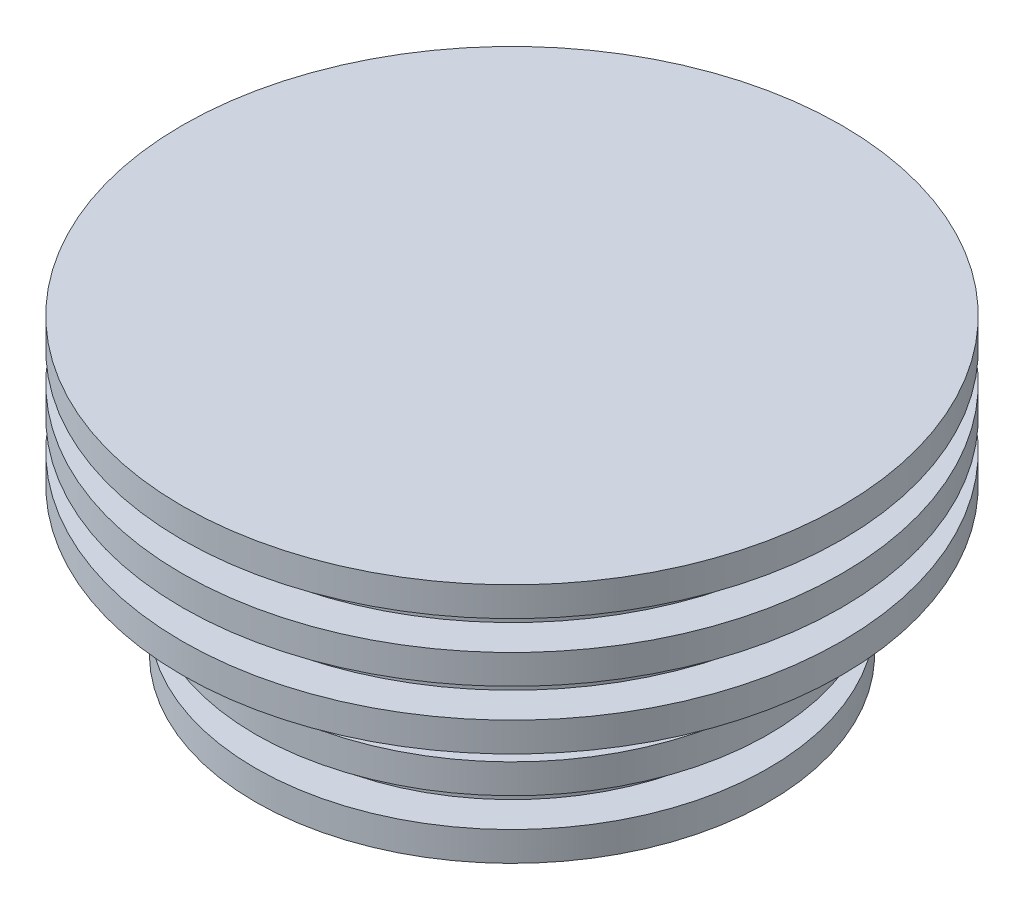
ISO-10303-21;
HEADER;
FILE_DESCRIPTION(('STEP AP214'),'2;1');
FILE_NAME('part.step','',(''),(''),'','','');
FILE_SCHEMA(('AUTOMOTIVE_DESIGN { 1 0 10303 214 1 1 1 1 }'));
ENDSEC;
DATA;
#1=APPLICATION_CONTEXT('core data for automotive mechanical design processes');
#2=APPLICATION_PROTOCOL_DEFINITION('international standard','automotive_design',2000,#1);
#3=PRODUCT_CONTEXT('',#1,'mechanical');
#4=PRODUCT('Part','Part','',(#3));
#5=PRODUCT_RELATED_PRODUCT_CATEGORY('part','',(#4));
#6=PRODUCT_DEFINITION_FORMATION('','',#4);
#7=PRODUCT_DEFINITION_CONTEXT('part definition',#1,'design');
#8=PRODUCT_DEFINITION('design','',#6,#7);
#9=PRODUCT_DEFINITION_SHAPE('','',#8);
#10=(LENGTH_UNIT() NAMED_UNIT(*) SI_UNIT(.MILLI.,.METRE.));
#11=(NAMED_UNIT(*) PLANE_ANGLE_UNIT() SI_UNIT($,.RADIAN.));
#12=(NAMED_UNIT(*) SI_UNIT($,.STERADIAN.) SOLID_ANGLE_UNIT());
#13=UNCERTAINTY_MEASURE_WITH_UNIT(LENGTH_MEASURE(1.E-05),#10,'distance_accuracy_value','');
#14=(GEOMETRIC_REPRESENTATION_CONTEXT(3) GLOBAL_UNCERTAINTY_ASSIGNED_CONTEXT((#13)) GLOBAL_UNIT_ASSIGNED_CONTEXT((#10,
#11,#12)) REPRESENTATION_CONTEXT('',''));
#15=CARTESIAN_POINT('',(0.,0.,0.));
#16=DIRECTION('',(0.,0.,1.));
#17=DIRECTION('',(1.,0.,0.));
#18=AXIS2_PLACEMENT_3D('',#15,#16,#17);
#19=CARTESIAN_POINT('',(0.,12.7,0.));
#20=DIRECTION('',(0.,-1.,0.));
#21=DIRECTION('',(0.,0.,-1.));
#22=AXIS2_PLACEMENT_3D('',#19,#20,#21);
#23=CYLINDRICAL_SURFACE('',#22,19.05);
#24=CARTESIAN_POINT('',(0.,2.54,0.));
#25=DIRECTION('',(0.,1.,0.));
#26=DIRECTION('',(0.,0.,1.));
#27=AXIS2_PLACEMENT_3D('',#24,#25,#26);
#28=CIRCLE('',#27,19.05);
#29=CARTESIAN_POINT('',(0.,2.54,19.05));
#30=VERTEX_POINT('',#29);
#31=EDGE_CURVE('E98',#30,#30,#28,.T.);
#32=ORIENTED_EDGE('',*,*,#31,.T.);
#33=EDGE_LOOP('',(#32));
#34=FACE_BOUND('',#33,.T.);
#35=CARTESIAN_POINT('',(0.,5.08,0.));
#36=DIRECTION('',(0.,1.,0.));
#37=DIRECTION('',(0.,0.,1.));
#38=AXIS2_PLACEMENT_3D('',#35,#36,#37);
#39=CIRCLE('',#38,19.05);
#40=CARTESIAN_POINT('',(0.,5.08,19.05));
#41=VERTEX_POINT('',#40);
#42=EDGE_CURVE('E86',#41,#41,#39,.T.);
#43=ORIENTED_EDGE('',*,*,#42,.F.);
#44=EDGE_LOOP('',(#43));
#45=FACE_BOUND('',#44,.T.);
#46=ADVANCED_FACE('F43',(#34,#45),#23,.T.);
#47=CARTESIAN_POINT('',(0.,2.54,0.));
#48=DIRECTION('',(0.,1.,0.));
#49=DIRECTION('',(0.,0.,1.));
#50=AXIS2_PLACEMENT_3D('',#47,#48,#49);
#51=PLANE('',#50);
#52=CARTESIAN_POINT('',(0.,2.54,0.));
#53=DIRECTION('',(0.,1.,0.));
#54=DIRECTION('',(0.,0.,1.));
#55=AXIS2_PLACEMENT_3D('',#52,#53,#54);
#56=CIRCLE('',#55,22.225);
#57=CARTESIAN_POINT('',(0.,2.54,22.225));
#58=VERTEX_POINT('',#57);
#59=EDGE_CURVE('E61',#58,#58,#56,.T.);
#60=ORIENTED_EDGE('',*,*,#59,.T.);
#61=EDGE_LOOP('',(#60));
#62=FACE_BOUND('',#61,.T.);
#63=ORIENTED_EDGE('',*,*,#31,.F.);
#64=EDGE_LOOP('',(#63));
#65=FACE_BOUND('',#64,.T.);
#66=ADVANCED_FACE('F122',(#62,#65),#51,.T.);
#67=CARTESIAN_POINT('',(0.,0.,0.));
#68=DIRECTION('',(0.,1.,0.));
#69=DIRECTION('',(0.,0.,1.));
#70=AXIS2_PLACEMENT_3D('',#67,#68,#69);
#71=PLANE('',#70);
#72=CARTESIAN_POINT('',(0.,0.,0.));
#73=DIRECTION('',(0.,1.,0.));
#74=DIRECTION('',(0.,0.,1.));
#75=AXIS2_PLACEMENT_3D('',#72,#73,#74);
#76=CIRCLE('',#75,22.225);
#77=CARTESIAN_POINT('',(0.,0.,22.225));
#78=VERTEX_POINT('',#77);
#79=EDGE_CURVE('E113',#78,#78,#76,.T.);
#80=ORIENTED_EDGE('',*,*,#79,.F.);
#81=EDGE_LOOP('',(#80));
#82=FACE_BOUND('',#81,.T.);
#83=ADVANCED_FACE('F125',(#82),#71,.F.);
#84=CARTESIAN_POINT('',(0.,2.54,0.));
#85=DIRECTION('',(0.,-1.,0.));
#86=DIRECTION('',(0.,0.,-1.));
#87=AXIS2_PLACEMENT_3D('',#84,#85,#86);
#88=CYLINDRICAL_SURFACE('',#87,22.225);
#89=ORIENTED_EDGE('',*,*,#59,.F.);
#90=EDGE_LOOP('',(#89));
#91=FACE_BOUND('',#90,.T.);
#92=ORIENTED_EDGE('',*,*,#79,.T.);
#93=EDGE_LOOP('',(#92));
#94=FACE_BOUND('',#93,.T.);
#95=ADVANCED_FACE('F44',(#91,#94),#88,.T.);
#96=CARTESIAN_POINT('',(0.,7.62,0.));
#97=DIRECTION('',(0.,1.,0.));
#98=DIRECTION('',(0.,0.,1.));
#99=AXIS2_PLACEMENT_3D('',#96,#97,#98);
#100=PLANE('',#99);
#101=CARTESIAN_POINT('',(0.,7.62,0.));
#102=DIRECTION('',(0.,1.,0.));
#103=DIRECTION('',(0.,0.,1.));
#104=AXIS2_PLACEMENT_3D('',#101,#102,#103);
#105=CIRCLE('',#104,22.225);
#106=CARTESIAN_POINT('',(0.,7.62,22.225));
#107=VERTEX_POINT('',#106);
#108=EDGE_CURVE('E94',#107,#107,#105,.T.);
#109=ORIENTED_EDGE('',*,*,#108,.T.);
#110=EDGE_LOOP('',(#109));
#111=FACE_BOUND('',#110,.T.);
#112=CARTESIAN_POINT('',(0.,7.62,0.));
#113=DIRECTION('',(0.,1.,0.));
#114=DIRECTION('',(0.,0.,1.));
#115=AXIS2_PLACEMENT_3D('',#112,#113,#114);
#116=CIRCLE('',#115,19.05);
#117=CARTESIAN_POINT('',(0.,7.62,19.05));
#118=VERTEX_POINT('',#117);
#119=EDGE_CURVE('E57',#118,#118,#116,.F.);
#120=ORIENTED_EDGE('',*,*,#119,.T.);
#121=EDGE_LOOP('',(#120));
#122=FACE_BOUND('',#121,.T.);
#123=ADVANCED_FACE('F128',(#111,#122),#100,.T.);
#124=CARTESIAN_POINT('',(0.,5.08,0.));
#125=DIRECTION('',(0.,1.,0.));
#126=DIRECTION('',(0.,0.,1.));
#127=AXIS2_PLACEMENT_3D('',#124,#125,#126);
#128=PLANE('',#127);
#129=CARTESIAN_POINT('',(0.,5.08,0.));
#130=DIRECTION('',(0.,1.,0.));
#131=DIRECTION('',(0.,0.,1.));
#132=AXIS2_PLACEMENT_3D('',#129,#130,#131);
#133=CIRCLE('',#132,22.225);
#134=CARTESIAN_POINT('',(0.,5.08,22.225));
#135=VERTEX_POINT('',#134);
#136=EDGE_CURVE('E95',#135,#135,#133,.T.);
#137=ORIENTED_EDGE('',*,*,#136,.F.);
#138=EDGE_LOOP('',(#137));
#139=FACE_BOUND('',#138,.T.);
#140=ORIENTED_EDGE('',*,*,#42,.T.);
#141=EDGE_LOOP('',(#140));
#142=FACE_BOUND('',#141,.T.);
#143=ADVANCED_FACE('F152',(#139,#142),#128,.F.);
#144=CARTESIAN_POINT('',(0.,7.62,0.));
#145=DIRECTION('',(0.,-1.,0.));
#146=DIRECTION('',(0.,0.,-1.));
#147=AXIS2_PLACEMENT_3D('',#144,#145,#146);
#148=CYLINDRICAL_SURFACE('',#147,22.225);
#149=ORIENTED_EDGE('',*,*,#108,.F.);
#150=EDGE_LOOP('',(#149));
#151=FACE_BOUND('',#150,.T.);
#152=ORIENTED_EDGE('',*,*,#136,.T.);
#153=EDGE_LOOP('',(#152));
#154=FACE_BOUND('',#153,.T.);
#155=ADVANCED_FACE('F144',(#151,#154),#148,.T.);
#156=ORIENTED_EDGE('',*,*,#119,.F.);
#157=EDGE_LOOP('',(#156));
#158=FACE_BOUND('',#157,.T.);
#159=CARTESIAN_POINT('',(0.,10.16,0.));
#160=DIRECTION('',(0.,1.,0.));
#161=DIRECTION('',(0.,0.,1.));
#162=AXIS2_PLACEMENT_3D('',#159,#160,#161);
#163=CIRCLE('',#162,19.05);
#164=CARTESIAN_POINT('',(0.,10.16,19.05));
#165=VERTEX_POINT('',#164);
#166=EDGE_CURVE('E83',#165,#165,#163,.T.);
#167=ORIENTED_EDGE('',*,*,#166,.F.);
#168=EDGE_LOOP('',(#167));
#169=FACE_BOUND('',#168,.T.);
#170=ADVANCED_FACE('F136',(#158,#169),#23,.T.);
#171=CARTESIAN_POINT('',(0.,10.16,0.));
#172=DIRECTION('',(0.,1.,0.));
#173=DIRECTION('',(0.,0.,1.));
#174=AXIS2_PLACEMENT_3D('',#171,#172,#173);
#175=PLANE('',#174);
#176=CARTESIAN_POINT('',(0.,10.16,0.));
#177=DIRECTION('',(0.,1.,0.));
#178=DIRECTION('',(0.,0.,1.));
#179=AXIS2_PLACEMENT_3D('',#176,#177,#178);
#180=CIRCLE('',#179,22.225);
#181=CARTESIAN_POINT('',(0.,10.16,22.225));
#182=VERTEX_POINT('',#181);
#183=EDGE_CURVE('E104',#182,#182,#180,.T.);
#184=ORIENTED_EDGE('',*,*,#183,.F.);
#185=EDGE_LOOP('',(#184));
#186=FACE_BOUND('',#185,.T.);
#187=ORIENTED_EDGE('',*,*,#166,.T.);
#188=EDGE_LOOP('',(#187));
#189=FACE_BOUND('',#188,.T.);
#190=ADVANCED_FACE('F145',(#186,#189),#175,.F.);
#191=CARTESIAN_POINT('',(0.,12.7,0.));
#192=DIRECTION('',(0.,-1.,0.));
#193=DIRECTION('',(0.,0.,-1.));
#194=AXIS2_PLACEMENT_3D('',#191,#192,#193);
#195=CYLINDRICAL_SURFACE('',#194,22.225);
#196=CARTESIAN_POINT('',(0.,12.7,0.));
#197=DIRECTION('',(0.,1.,0.));
#198=DIRECTION('',(0.,0.,1.));
#199=AXIS2_PLACEMENT_3D('',#196,#197,#198);
#200=CIRCLE('',#199,22.225);
#201=CARTESIAN_POINT('',(0.,12.7,22.225));
#202=VERTEX_POINT('',#201);
#203=EDGE_CURVE('E91',#202,#202,#200,.T.);
#204=ORIENTED_EDGE('',*,*,#203,.F.);
#205=EDGE_LOOP('',(#204));
#206=FACE_BOUND('',#205,.T.);
#207=ORIENTED_EDGE('',*,*,#183,.T.);
#208=EDGE_LOOP('',(#207));
#209=FACE_BOUND('',#208,.T.);
#210=ADVANCED_FACE('F151',(#206,#209),#195,.T.);
#211=CARTESIAN_POINT('',(0.,12.7,0.));
#212=DIRECTION('',(0.,1.,0.));
#213=DIRECTION('',(0.,0.,1.));
#214=AXIS2_PLACEMENT_3D('',#211,#212,#213);
#215=PLANE('',#214);
#216=ORIENTED_EDGE('',*,*,#203,.T.);
#217=EDGE_LOOP('',(#216));
#218=FACE_BOUND('',#217,.T.);
#219=CARTESIAN_POINT('',(0.,12.7,0.));
#220=DIRECTION('',(0.,-1.,0.));
#221=DIRECTION('',(0.,0.,-1.));
#222=AXIS2_PLACEMENT_3D('',#219,#220,#221);
#223=CIRCLE('',#222,28.575);
#224=CARTESIAN_POINT('',(0.,12.7,-28.575));
#225=VERTEX_POINT('',#224);
#226=EDGE_CURVE('E71',#225,#225,#223,.T.);
#227=ORIENTED_EDGE('',*,*,#226,.T.);
#228=EDGE_LOOP('',(#227));
#229=FACE_BOUND('',#228,.T.);
#230=ADVANCED_FACE('F175',(#218,#229),#215,.F.);
#231=CARTESIAN_POINT('',(0.,15.24,0.));
#232=DIRECTION('',(0.,-1.,0.));
#233=DIRECTION('',(0.,0.,-1.));
#234=AXIS2_PLACEMENT_3D('',#231,#232,#233);
#235=CYLINDRICAL_SURFACE('',#234,28.575);
#236=CARTESIAN_POINT('',(0.,15.24,0.));
#237=DIRECTION('',(0.,-1.,0.));
#238=DIRECTION('',(0.,0.,-1.));
#239=AXIS2_PLACEMENT_3D('',#236,#237,#238);
#240=CIRCLE('',#239,28.575);
#241=CARTESIAN_POINT('',(0.,15.24,-28.575));
#242=VERTEX_POINT('',#241);
#243=EDGE_CURVE('E80',#242,#242,#240,.T.);
#244=ORIENTED_EDGE('',*,*,#243,.T.);
#245=EDGE_LOOP('',(#244));
#246=FACE_BOUND('',#245,.T.);
#247=ORIENTED_EDGE('',*,*,#226,.F.);
#248=EDGE_LOOP('',(#247));
#249=FACE_BOUND('',#248,.T.);
#250=ADVANCED_FACE('F180',(#246,#249),#235,.T.);
#251=CARTESIAN_POINT('',(0.,15.24,0.));
#252=DIRECTION('',(0.,-1.,0.));
#253=DIRECTION('',(0.,0.,-1.));
#254=AXIS2_PLACEMENT_3D('',#251,#252,#253);
#255=PLANE('',#254);
#256=CARTESIAN_POINT('',(0.,15.24,0.));
#257=DIRECTION('',(0.,-1.,0.));
#258=DIRECTION('',(0.,0.,-1.));
#259=AXIS2_PLACEMENT_3D('',#256,#257,#258);
#260=CIRCLE('',#259,25.4);
#261=CARTESIAN_POINT('',(0.,15.24,-25.4));
#262=VERTEX_POINT('',#261);
#263=EDGE_CURVE('E51',#262,#262,#260,.T.);
#264=ORIENTED_EDGE('',*,*,#263,.T.);
#265=EDGE_LOOP('',(#264));
#266=FACE_BOUND('',#265,.T.);
#267=ORIENTED_EDGE('',*,*,#243,.F.);
#268=EDGE_LOOP('',(#267));
#269=FACE_BOUND('',#268,.T.);
#270=ADVANCED_FACE('F189',(#266,#269),#255,.F.);
#271=CARTESIAN_POINT('',(0.,25.4,0.));
#272=DIRECTION('',(0.,-1.,0.));
#273=DIRECTION('',(0.,0.,-1.));
#274=AXIS2_PLACEMENT_3D('',#271,#272,#273);
#275=CYLINDRICAL_SURFACE('',#274,25.4);
#276=CARTESIAN_POINT('',(0.,17.78,0.));
#277=DIRECTION('',(0.,-1.,0.));
#278=DIRECTION('',(0.,0.,-1.));
#279=AXIS2_PLACEMENT_3D('',#276,#277,#278);
#280=CIRCLE('',#279,25.4);
#281=CARTESIAN_POINT('',(0.,17.78,-25.4));
#282=VERTEX_POINT('',#281);
#283=EDGE_CURVE('E68',#282,#282,#280,.T.);
#284=ORIENTED_EDGE('',*,*,#283,.T.);
#285=EDGE_LOOP('',(#284));
#286=FACE_BOUND('',#285,.T.);
#287=ORIENTED_EDGE('',*,*,#263,.F.);
#288=EDGE_LOOP('',(#287));
#289=FACE_BOUND('',#288,.T.);
#290=ADVANCED_FACE('F168',(#286,#289),#275,.T.);
#291=CARTESIAN_POINT('',(0.,20.32,0.));
#292=DIRECTION('',(0.,-1.,0.));
#293=DIRECTION('',(0.,0.,-1.));
#294=AXIS2_PLACEMENT_3D('',#291,#292,#293);
#295=CYLINDRICAL_SURFACE('',#294,28.575);
#296=CARTESIAN_POINT('',(0.,20.32,0.));
#297=DIRECTION('',(0.,-1.,0.));
#298=DIRECTION('',(0.,0.,-1.));
#299=AXIS2_PLACEMENT_3D('',#296,#297,#298);
#300=CIRCLE('',#299,28.575);
#301=CARTESIAN_POINT('',(0.,20.32,-28.575));
#302=VERTEX_POINT('',#301);
#303=EDGE_CURVE('E67',#302,#302,#300,.T.);
#304=ORIENTED_EDGE('',*,*,#303,.T.);
#305=EDGE_LOOP('',(#304));
#306=FACE_BOUND('',#305,.T.);
#307=CARTESIAN_POINT('',(0.,17.78,0.));
#308=DIRECTION('',(0.,-1.,0.));
#309=DIRECTION('',(0.,0.,-1.));
#310=AXIS2_PLACEMENT_3D('',#307,#308,#309);
#311=CIRCLE('',#310,28.575);
#312=CARTESIAN_POINT('',(0.,17.78,-28.575));
#313=VERTEX_POINT('',#312);
#314=EDGE_CURVE('E222',#313,#313,#311,.T.);
#315=ORIENTED_EDGE('',*,*,#314,.F.);
#316=EDGE_LOOP('',(#315));
#317=FACE_BOUND('',#316,.T.);
#318=ADVANCED_FACE('F202',(#306,#317),#295,.T.);
#319=CARTESIAN_POINT('',(0.,20.32,0.));
#320=DIRECTION('',(0.,-1.,0.));
#321=DIRECTION('',(0.,0.,-1.));
#322=AXIS2_PLACEMENT_3D('',#319,#320,#321);
#323=PLANE('',#322);
#324=CARTESIAN_POINT('',(0.,20.32,0.));
#325=DIRECTION('',(0.,-1.,0.));
#326=DIRECTION('',(0.,0.,-1.));
#327=AXIS2_PLACEMENT_3D('',#324,#325,#326);
#328=CIRCLE('',#327,25.4);
#329=CARTESIAN_POINT('',(0.,20.32,-25.4));
#330=VERTEX_POINT('',#329);
#331=EDGE_CURVE('E10',#330,#330,#328,.T.);
#332=ORIENTED_EDGE('',*,*,#331,.T.);
#333=EDGE_LOOP('',(#332));
#334=FACE_BOUND('',#333,.T.);
#335=ORIENTED_EDGE('',*,*,#303,.F.);
#336=EDGE_LOOP('',(#335));
#337=FACE_BOUND('',#336,.T.);
#338=ADVANCED_FACE('F208',(#334,#337),#323,.F.);
#339=CARTESIAN_POINT('',(0.,17.78,0.));
#340=DIRECTION('',(0.,-1.,0.));
#341=DIRECTION('',(0.,0.,-1.));
#342=AXIS2_PLACEMENT_3D('',#339,#340,#341);
#343=PLANE('',#342);
#344=ORIENTED_EDGE('',*,*,#283,.F.);
#345=EDGE_LOOP('',(#344));
#346=FACE_BOUND('',#345,.T.);
#347=ORIENTED_EDGE('',*,*,#314,.T.);
#348=EDGE_LOOP('',(#347));
#349=FACE_BOUND('',#348,.T.);
#350=ADVANCED_FACE('F209',(#346,#349),#343,.T.);
#351=CARTESIAN_POINT('',(0.,22.86,0.));
#352=DIRECTION('',(0.,-1.,0.));
#353=DIRECTION('',(0.,0.,-1.));
#354=AXIS2_PLACEMENT_3D('',#351,#352,#353);
#355=CIRCLE('',#354,25.4);
#356=CARTESIAN_POINT('',(0.,22.86,-25.4));
#357=VERTEX_POINT('',#356);
#358=EDGE_CURVE('E69',#357,#357,#355,.T.);
#359=ORIENTED_EDGE('',*,*,#358,.T.);
#360=EDGE_LOOP('',(#359));
#361=FACE_BOUND('',#360,.T.);
#362=ORIENTED_EDGE('',*,*,#331,.F.);
#363=EDGE_LOOP('',(#362));
#364=FACE_BOUND('',#363,.T.);
#365=ADVANCED_FACE('F199',(#361,#364),#275,.T.);
#366=CARTESIAN_POINT('',(0.,25.4,0.));
#367=DIRECTION('',(0.,-1.,0.));
#368=DIRECTION('',(0.,0.,-1.));
#369=AXIS2_PLACEMENT_3D('',#366,#367,#368);
#370=CYLINDRICAL_SURFACE('',#369,28.575);
#371=CARTESIAN_POINT('',(0.,25.4,0.));
#372=DIRECTION('',(0.,-1.,0.));
#373=DIRECTION('',(0.,0.,-1.));
#374=AXIS2_PLACEMENT_3D('',#371,#372,#373);
#375=CIRCLE('',#374,28.575);
#376=CARTESIAN_POINT('',(0.,25.4,-28.575));
#377=VERTEX_POINT('',#376);
#378=EDGE_CURVE('E223',#377,#377,#375,.T.);
#379=ORIENTED_EDGE('',*,*,#378,.T.);
#380=EDGE_LOOP('',(#379));
#381=FACE_BOUND('',#380,.T.);
#382=CARTESIAN_POINT('',(0.,22.86,0.));
#383=DIRECTION('',(0.,-1.,0.));
#384=DIRECTION('',(0.,0.,-1.));
#385=AXIS2_PLACEMENT_3D('',#382,#383,#384);
#386=CIRCLE('',#385,28.575);
#387=CARTESIAN_POINT('',(0.,22.86,-28.575));
#388=VERTEX_POINT('',#387);
#389=EDGE_CURVE('E227',#388,#388,#386,.T.);
#390=ORIENTED_EDGE('',*,*,#389,.F.);
#391=EDGE_LOOP('',(#390));
#392=FACE_BOUND('',#391,.T.);
#393=ADVANCED_FACE('F197',(#381,#392),#370,.T.);
#394=CARTESIAN_POINT('',(0.,22.86,0.));
#395=DIRECTION('',(0.,-1.,0.));
#396=DIRECTION('',(0.,0.,-1.));
#397=AXIS2_PLACEMENT_3D('',#394,#395,#396);
#398=PLANE('',#397);
#399=ORIENTED_EDGE('',*,*,#358,.F.);
#400=EDGE_LOOP('',(#399));
#401=FACE_BOUND('',#400,.T.);
#402=ORIENTED_EDGE('',*,*,#389,.T.);
#403=EDGE_LOOP('',(#402));
#404=FACE_BOUND('',#403,.T.);
#405=ADVANCED_FACE('F191',(#401,#404),#398,.T.);
#406=CARTESIAN_POINT('',(0.,25.4,0.));
#407=DIRECTION('',(0.,1.,0.));
#408=DIRECTION('',(0.,0.,1.));
#409=AXIS2_PLACEMENT_3D('',#406,#407,#408);
#410=PLANE('',#409);
#411=ORIENTED_EDGE('',*,*,#378,.F.);
#412=EDGE_LOOP('',(#411));
#413=FACE_BOUND('',#412,.T.);
#414=ADVANCED_FACE('F187',(#413),#410,.T.);
#415=CLOSED_SHELL('',(#46,#66,#83,#95,#123,#143,#155,#170,#190,#210,#230,#250,#270,#290,#318,
#338,#350,#365,#393,#405,#414));
#416=MANIFOLD_SOLID_BREP('B2',#415);
#417=ADVANCED_BREP_SHAPE_REPRESENTATION('',(#18,#416),#14);
#418=SHAPE_DEFINITION_REPRESENTATION(#9,#417);
ENDSEC;
END-ISO-10303-21;
